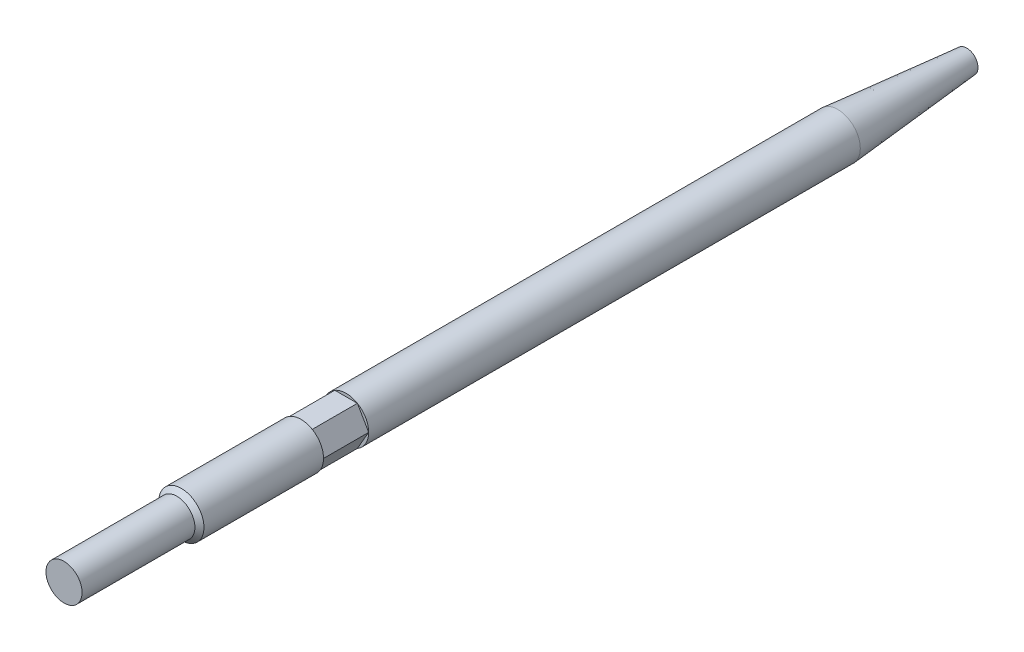
ISO-10303-21;
HEADER;
FILE_DESCRIPTION(('STEP AP214'),'2;1');
FILE_NAME('part.step','',(''),(''),'','','');
FILE_SCHEMA(('AUTOMOTIVE_DESIGN { 1 0 10303 214 1 1 1 1 }'));
ENDSEC;
DATA;
#1=APPLICATION_CONTEXT('core data for automotive mechanical design processes');
#2=APPLICATION_PROTOCOL_DEFINITION('international standard','automotive_design',2000,#1);
#3=PRODUCT_CONTEXT('',#1,'mechanical');
#4=PRODUCT('Part','Part','',(#3));
#5=PRODUCT_RELATED_PRODUCT_CATEGORY('part','',(#4));
#6=PRODUCT_DEFINITION_FORMATION('','',#4);
#7=PRODUCT_DEFINITION_CONTEXT('part definition',#1,'design');
#8=PRODUCT_DEFINITION('design','',#6,#7);
#9=PRODUCT_DEFINITION_SHAPE('','',#8);
#10=(LENGTH_UNIT() NAMED_UNIT(*) SI_UNIT(.MILLI.,.METRE.));
#11=(NAMED_UNIT(*) PLANE_ANGLE_UNIT() SI_UNIT($,.RADIAN.));
#12=(NAMED_UNIT(*) SI_UNIT($,.STERADIAN.) SOLID_ANGLE_UNIT());
#13=UNCERTAINTY_MEASURE_WITH_UNIT(LENGTH_MEASURE(1.E-05),#10,'distance_accuracy_value','');
#14=(GEOMETRIC_REPRESENTATION_CONTEXT(3) GLOBAL_UNCERTAINTY_ASSIGNED_CONTEXT((#13)) GLOBAL_UNIT_ASSIGNED_CONTEXT((#10,
#11,#12)) REPRESENTATION_CONTEXT('',''));
#15=CARTESIAN_POINT('',(0.,0.,0.));
#16=DIRECTION('',(0.,0.,1.));
#17=DIRECTION('',(1.,0.,0.));
#18=AXIS2_PLACEMENT_3D('',#15,#16,#17);
#19=CARTESIAN_POINT('',(0.,0.,500.));
#20=DIRECTION('',(0.,0.,-1.));
#21=DIRECTION('',(-1.,0.,0.));
#22=AXIS2_PLACEMENT_3D('',#19,#20,#21);
#23=CYLINDRICAL_SURFACE('',#22,10.);
#24=CARTESIAN_POINT('',(0.,0.,448.));
#25=DIRECTION('',(0.,0.,1.));
#26=DIRECTION('',(1.,0.,0.));
#27=AXIS2_PLACEMENT_3D('',#24,#25,#26);
#28=CIRCLE('',#27,10.);
#29=CARTESIAN_POINT('',(10.,0.,448.));
#30=VERTEX_POINT('',#29);
#31=EDGE_CURVE('E145',#30,#30,#28,.F.);
#32=ORIENTED_EDGE('',*,*,#31,.T.);
#33=EDGE_LOOP('',(#32));
#34=FACE_BOUND('',#33,.T.);
#35=CARTESIAN_POINT('',(0.,0.,395.));
#36=DIRECTION('',(0.,0.,1.));
#37=DIRECTION('',(1.,0.,0.));
#38=AXIS2_PLACEMENT_3D('',#35,#36,#37);
#39=CIRCLE('',#38,10.);
#40=CARTESIAN_POINT('',(10.,0.,395.));
#41=VERTEX_POINT('',#40);
#42=CARTESIAN_POINT('',(5.,8.66025403784438,395.));
#43=VERTEX_POINT('',#42);
#44=EDGE_CURVE('E136',#41,#43,#39,.T.);
#45=ORIENTED_EDGE('',*,*,#44,.T.);
#46=CARTESIAN_POINT('',(-5.,8.66025403784439,395.));
#47=VERTEX_POINT('',#46);
#48=EDGE_CURVE('E101',#43,#47,#39,.T.);
#49=ORIENTED_EDGE('',*,*,#48,.T.);
#50=CARTESIAN_POINT('',(-9.99999999999999,0.,395.));
#51=VERTEX_POINT('',#50);
#52=EDGE_CURVE('E137',#47,#51,#39,.T.);
#53=ORIENTED_EDGE('',*,*,#52,.T.);
#54=CARTESIAN_POINT('',(-4.99999999999999,-8.66025403784439,395.));
#55=VERTEX_POINT('',#54);
#56=EDGE_CURVE('E138',#51,#55,#39,.T.);
#57=ORIENTED_EDGE('',*,*,#56,.T.);
#58=CARTESIAN_POINT('',(5.,-8.66025403784439,395.));
#59=VERTEX_POINT('',#58);
#60=EDGE_CURVE('E143',#55,#59,#39,.T.);
#61=ORIENTED_EDGE('',*,*,#60,.T.);
#62=EDGE_CURVE('E150',#59,#41,#39,.T.);
#63=ORIENTED_EDGE('',*,*,#62,.T.);
#64=EDGE_LOOP('',(#45,#49,#53,#57,#61,#63));
#65=FACE_BOUND('',#64,.T.);
#66=ADVANCED_FACE('F34',(#34,#65),#23,.T.);
#67=CARTESIAN_POINT('',(0.,0.,450.));
#68=DIRECTION('',(0.,0.,1.));
#69=DIRECTION('',(1.,0.,0.));
#70=AXIS2_PLACEMENT_3D('',#67,#68,#69);
#71=CYLINDRICAL_SURFACE('',#70,8.);
#72=CARTESIAN_POINT('',(0.,0.,450.));
#73=DIRECTION('',(0.,0.,1.));
#74=DIRECTION('',(1.,0.,0.));
#75=AXIS2_PLACEMENT_3D('',#72,#73,#74);
#76=CIRCLE('',#75,8.);
#77=CARTESIAN_POINT('',(8.,0.,450.));
#78=VERTEX_POINT('',#77);
#79=EDGE_CURVE('E161',#78,#78,#76,.T.);
#80=ORIENTED_EDGE('',*,*,#79,.T.);
#81=EDGE_LOOP('',(#80));
#82=FACE_BOUND('',#81,.T.);
#83=CARTESIAN_POINT('',(0.,0.,500.));
#84=DIRECTION('',(0.,0.,1.));
#85=DIRECTION('',(1.,0.,0.));
#86=AXIS2_PLACEMENT_3D('',#83,#84,#85);
#87=CIRCLE('',#86,8.);
#88=CARTESIAN_POINT('',(8.,0.,500.));
#89=VERTEX_POINT('',#88);
#90=EDGE_CURVE('E162',#89,#89,#87,.T.);
#91=ORIENTED_EDGE('',*,*,#90,.F.);
#92=EDGE_LOOP('',(#91));
#93=FACE_BOUND('',#92,.T.);
#94=ADVANCED_FACE('F211',(#82,#93),#71,.T.);
#95=CARTESIAN_POINT('',(0.,0.,500.));
#96=DIRECTION('',(0.,0.,1.));
#97=DIRECTION('',(1.,0.,0.));
#98=AXIS2_PLACEMENT_3D('',#95,#96,#97);
#99=PLANE('',#98);
#100=ORIENTED_EDGE('',*,*,#90,.T.);
#101=EDGE_LOOP('',(#100));
#102=FACE_BOUND('',#101,.T.);
#103=ADVANCED_FACE('F217',(#102),#99,.T.);
#104=CARTESIAN_POINT('',(0.,0.,450.));
#105=DIRECTION('',(0.,0.,-1.));
#106=DIRECTION('',(-1.,0.,0.));
#107=AXIS2_PLACEMENT_3D('',#104,#105,#106);
#108=CONICAL_SURFACE('',#107,8.00000000000012,0.785398163397474);
#109=ORIENTED_EDGE('',*,*,#31,.F.);
#110=EDGE_LOOP('',(#109));
#111=FACE_BOUND('',#110,.T.);
#112=ORIENTED_EDGE('',*,*,#79,.F.);
#113=EDGE_LOOP('',(#112));
#114=FACE_BOUND('',#113,.T.);
#115=ADVANCED_FACE('F240',(#111,#114),#108,.T.);
#116=CARTESIAN_POINT('',(0.,0.,375.));
#117=DIRECTION('',(0.,0.,1.));
#118=DIRECTION('',(1.,0.,0.));
#119=AXIS2_PLACEMENT_3D('',#116,#117,#118);
#120=PLANE('',#119);
#121=CARTESIAN_POINT('',(0.,0.,375.));
#122=DIRECTION('',(0.,0.,1.));
#123=DIRECTION('',(1.,0.,0.));
#124=AXIS2_PLACEMENT_3D('',#121,#122,#123);
#125=CIRCLE('',#124,10.);
#126=CARTESIAN_POINT('',(10.,0.,375.));
#127=VERTEX_POINT('',#126);
#128=CARTESIAN_POINT('',(5.,8.66025403784438,375.));
#129=VERTEX_POINT('',#128);
#130=EDGE_CURVE('E92',#127,#129,#125,.T.);
#131=ORIENTED_EDGE('',*,*,#130,.T.);
#132=DIRECTION('',(-0.5,0.866025403784439,0.));
#133=VECTOR('',#132,1.);
#134=CARTESIAN_POINT('',(10.,0.,375.));
#135=LINE('',#134,#133);
#136=EDGE_CURVE('E96',#127,#129,#135,.T.);
#137=ORIENTED_EDGE('',*,*,#136,.F.);
#138=EDGE_LOOP('',(#131,#137));
#139=FACE_BOUND('',#138,.T.);
#140=ADVANCED_FACE('F94',(#139),#120,.T.);
#141=CARTESIAN_POINT('',(-5.,8.66025403784439,375.));
#142=VERTEX_POINT('',#141);
#143=EDGE_CURVE('E104',#129,#142,#125,.T.);
#144=ORIENTED_EDGE('',*,*,#143,.T.);
#145=DIRECTION('',(-1.,0.,0.));
#146=VECTOR('',#145,1.);
#147=CARTESIAN_POINT('',(5.,8.66025403784438,375.));
#148=LINE('',#147,#146);
#149=EDGE_CURVE('E112',#129,#142,#148,.T.);
#150=ORIENTED_EDGE('',*,*,#149,.F.);
#151=EDGE_LOOP('',(#144,#150));
#152=FACE_BOUND('',#151,.T.);
#153=ADVANCED_FACE('F121',(#152),#120,.T.);
#154=CARTESIAN_POINT('',(-9.99999999999999,0.,375.));
#155=VERTEX_POINT('',#154);
#156=EDGE_CURVE('E132',#142,#155,#125,.T.);
#157=ORIENTED_EDGE('',*,*,#156,.T.);
#158=DIRECTION('',(-0.5,-0.866025403784439,0.));
#159=VECTOR('',#158,1.);
#160=CARTESIAN_POINT('',(-5.,8.66025403784439,375.));
#161=LINE('',#160,#159);
#162=EDGE_CURVE('E123',#142,#155,#161,.T.);
#163=ORIENTED_EDGE('',*,*,#162,.F.);
#164=EDGE_LOOP('',(#157,#163));
#165=FACE_BOUND('',#164,.T.);
#166=ADVANCED_FACE('F199',(#165),#120,.T.);
#167=CARTESIAN_POINT('',(-4.99999999999999,-8.66025403784439,375.));
#168=VERTEX_POINT('',#167);
#169=EDGE_CURVE('E139',#155,#168,#125,.T.);
#170=ORIENTED_EDGE('',*,*,#169,.T.);
#171=DIRECTION('',(0.5,-0.866025403784439,0.));
#172=VECTOR('',#171,1.);
#173=CARTESIAN_POINT('',(-9.99999999999999,0.,375.));
#174=LINE('',#173,#172);
#175=EDGE_CURVE('E191',#155,#168,#174,.T.);
#176=ORIENTED_EDGE('',*,*,#175,.F.);
#177=EDGE_LOOP('',(#170,#176));
#178=FACE_BOUND('',#177,.T.);
#179=ADVANCED_FACE('F201',(#178),#120,.T.);
#180=CARTESIAN_POINT('',(5.,-8.66025403784439,375.));
#181=VERTEX_POINT('',#180);
#182=EDGE_CURVE('E146',#168,#181,#125,.T.);
#183=ORIENTED_EDGE('',*,*,#182,.T.);
#184=DIRECTION('',(1.,0.,0.));
#185=VECTOR('',#184,1.);
#186=CARTESIAN_POINT('',(-4.99999999999999,-8.66025403784439,375.));
#187=LINE('',#186,#185);
#188=EDGE_CURVE('E58',#168,#181,#187,.T.);
#189=ORIENTED_EDGE('',*,*,#188,.F.);
#190=EDGE_LOOP('',(#183,#189));
#191=FACE_BOUND('',#190,.T.);
#192=ADVANCED_FACE('F207',(#191),#120,.T.);
#193=EDGE_CURVE('E102',#181,#127,#125,.T.);
#194=ORIENTED_EDGE('',*,*,#193,.T.);
#195=DIRECTION('',(0.5,0.866025403784439,0.));
#196=VECTOR('',#195,1.);
#197=CARTESIAN_POINT('',(5.,-8.66025403784439,375.));
#198=LINE('',#197,#196);
#199=EDGE_CURVE('E118',#181,#127,#198,.T.);
#200=ORIENTED_EDGE('',*,*,#199,.F.);
#201=EDGE_LOOP('',(#194,#200));
#202=FACE_BOUND('',#201,.T.);
#203=ADVANCED_FACE('F251',(#202),#120,.T.);
#204=CARTESIAN_POINT('',(0.,0.,395.));
#205=DIRECTION('',(0.,0.,1.));
#206=DIRECTION('',(1.,0.,0.));
#207=AXIS2_PLACEMENT_3D('',#204,#205,#206);
#208=PLANE('',#207);
#209=DIRECTION('',(-0.5,0.866025403784439,0.));
#210=VECTOR('',#209,1.);
#211=CARTESIAN_POINT('',(10.,0.,395.));
#212=LINE('',#211,#210);
#213=EDGE_CURVE('E50',#41,#43,#212,.T.);
#214=ORIENTED_EDGE('',*,*,#213,.T.);
#215=ORIENTED_EDGE('',*,*,#44,.F.);
#216=EDGE_LOOP('',(#214,#215));
#217=FACE_BOUND('',#216,.T.);
#218=ADVANCED_FACE('F238',(#217),#208,.F.);
#219=DIRECTION('',(-1.,0.,0.));
#220=VECTOR('',#219,1.);
#221=CARTESIAN_POINT('',(5.,8.66025403784438,395.));
#222=LINE('',#221,#220);
#223=EDGE_CURVE('E115',#43,#47,#222,.T.);
#224=ORIENTED_EDGE('',*,*,#223,.T.);
#225=ORIENTED_EDGE('',*,*,#48,.F.);
#226=EDGE_LOOP('',(#224,#225));
#227=FACE_BOUND('',#226,.T.);
#228=ADVANCED_FACE('F267',(#227),#208,.F.);
#229=DIRECTION('',(-0.5,-0.866025403784439,0.));
#230=VECTOR('',#229,1.);
#231=CARTESIAN_POINT('',(-5.,8.66025403784439,395.));
#232=LINE('',#231,#230);
#233=EDGE_CURVE('E184',#47,#51,#232,.T.);
#234=ORIENTED_EDGE('',*,*,#233,.T.);
#235=ORIENTED_EDGE('',*,*,#52,.F.);
#236=EDGE_LOOP('',(#234,#235));
#237=FACE_BOUND('',#236,.T.);
#238=ADVANCED_FACE('F392',(#237),#208,.F.);
#239=DIRECTION('',(0.5,-0.866025403784439,0.));
#240=VECTOR('',#239,1.);
#241=CARTESIAN_POINT('',(-9.99999999999999,0.,395.));
#242=LINE('',#241,#240);
#243=EDGE_CURVE('E181',#51,#55,#242,.T.);
#244=ORIENTED_EDGE('',*,*,#243,.T.);
#245=ORIENTED_EDGE('',*,*,#56,.F.);
#246=EDGE_LOOP('',(#244,#245));
#247=FACE_BOUND('',#246,.T.);
#248=ADVANCED_FACE('F384',(#247),#208,.F.);
#249=DIRECTION('',(1.,0.,0.));
#250=VECTOR('',#249,1.);
#251=CARTESIAN_POINT('',(-4.99999999999999,-8.66025403784439,395.));
#252=LINE('',#251,#250);
#253=EDGE_CURVE('E178',#55,#59,#252,.T.);
#254=ORIENTED_EDGE('',*,*,#253,.T.);
#255=ORIENTED_EDGE('',*,*,#60,.F.);
#256=EDGE_LOOP('',(#254,#255));
#257=FACE_BOUND('',#256,.T.);
#258=ADVANCED_FACE('F376',(#257),#208,.F.);
#259=DIRECTION('',(0.5,0.866025403784439,0.));
#260=VECTOR('',#259,1.);
#261=CARTESIAN_POINT('',(5.,-8.66025403784439,395.));
#262=LINE('',#261,#260);
#263=EDGE_CURVE('E128',#59,#41,#262,.T.);
#264=ORIENTED_EDGE('',*,*,#263,.T.);
#265=ORIENTED_EDGE('',*,*,#62,.F.);
#266=EDGE_LOOP('',(#264,#265));
#267=FACE_BOUND('',#266,.T.);
#268=ADVANCED_FACE('F269',(#267),#208,.F.);
#269=CARTESIAN_POINT('',(10.,0.,375.));
#270=DIRECTION('',(0.866025403784439,0.5,0.));
#271=DIRECTION('',(-0.5,0.866025403784439,0.));
#272=AXIS2_PLACEMENT_3D('',#269,#270,#271);
#273=PLANE('',#272);
#274=ORIENTED_EDGE('',*,*,#213,.F.);
#275=DIRECTION('',(0.,0.,1.));
#276=VECTOR('',#275,1.);
#277=CARTESIAN_POINT('',(10.,0.,375.));
#278=LINE('',#277,#276);
#279=EDGE_CURVE('E127',#127,#41,#278,.T.);
#280=ORIENTED_EDGE('',*,*,#279,.F.);
#281=ORIENTED_EDGE('',*,*,#136,.T.);
#282=DIRECTION('',(0.,0.,1.));
#283=VECTOR('',#282,1.);
#284=CARTESIAN_POINT('',(5.,8.66025403784438,375.));
#285=LINE('',#284,#283);
#286=EDGE_CURVE('E108',#129,#43,#285,.T.);
#287=ORIENTED_EDGE('',*,*,#286,.T.);
#288=EDGE_LOOP('',(#274,#280,#281,#287));
#289=FACE_BOUND('',#288,.T.);
#290=ADVANCED_FACE('F125',(#289),#273,.T.);
#291=CARTESIAN_POINT('',(5.,-8.66025403784439,375.));
#292=DIRECTION('',(0.866025403784439,-0.5,0.));
#293=DIRECTION('',(0.5,0.866025403784439,0.));
#294=AXIS2_PLACEMENT_3D('',#291,#292,#293);
#295=PLANE('',#294);
#296=ORIENTED_EDGE('',*,*,#263,.F.);
#297=DIRECTION('',(0.,0.,1.));
#298=VECTOR('',#297,1.);
#299=CARTESIAN_POINT('',(5.,-8.66025403784439,375.));
#300=LINE('',#299,#298);
#301=EDGE_CURVE('E174',#181,#59,#300,.T.);
#302=ORIENTED_EDGE('',*,*,#301,.F.);
#303=ORIENTED_EDGE('',*,*,#199,.T.);
#304=ORIENTED_EDGE('',*,*,#279,.T.);
#305=EDGE_LOOP('',(#296,#302,#303,#304));
#306=FACE_BOUND('',#305,.T.);
#307=ADVANCED_FACE('F354',(#306),#295,.T.);
#308=CARTESIAN_POINT('',(-4.99999999999999,-8.66025403784439,375.));
#309=DIRECTION('',(0.,-1.,0.));
#310=DIRECTION('',(0.,0.,-1.));
#311=AXIS2_PLACEMENT_3D('',#308,#309,#310);
#312=PLANE('',#311);
#313=ORIENTED_EDGE('',*,*,#253,.F.);
#314=DIRECTION('',(0.,0.,1.));
#315=VECTOR('',#314,1.);
#316=CARTESIAN_POINT('',(-4.99999999999999,-8.66025403784439,375.));
#317=LINE('',#316,#315);
#318=EDGE_CURVE('E171',#168,#55,#317,.T.);
#319=ORIENTED_EDGE('',*,*,#318,.F.);
#320=ORIENTED_EDGE('',*,*,#188,.T.);
#321=ORIENTED_EDGE('',*,*,#301,.T.);
#322=EDGE_LOOP('',(#313,#319,#320,#321));
#323=FACE_BOUND('',#322,.T.);
#324=ADVANCED_FACE('F345',(#323),#312,.T.);
#325=CARTESIAN_POINT('',(-9.99999999999999,0.,375.));
#326=DIRECTION('',(-0.866025403784438,-0.5,0.));
#327=DIRECTION('',(0.5,-0.866025403784439,0.));
#328=AXIS2_PLACEMENT_3D('',#325,#326,#327);
#329=PLANE('',#328);
#330=ORIENTED_EDGE('',*,*,#243,.F.);
#331=DIRECTION('',(0.,0.,1.));
#332=VECTOR('',#331,1.);
#333=CARTESIAN_POINT('',(-9.99999999999999,0.,375.));
#334=LINE('',#333,#332);
#335=EDGE_CURVE('E168',#155,#51,#334,.T.);
#336=ORIENTED_EDGE('',*,*,#335,.F.);
#337=ORIENTED_EDGE('',*,*,#175,.T.);
#338=ORIENTED_EDGE('',*,*,#318,.T.);
#339=EDGE_LOOP('',(#330,#336,#337,#338));
#340=FACE_BOUND('',#339,.T.);
#341=ADVANCED_FACE('F337',(#340),#329,.T.);
#342=CARTESIAN_POINT('',(-5.,8.66025403784439,375.));
#343=DIRECTION('',(-0.866025403784439,0.5,0.));
#344=DIRECTION('',(-0.5,-0.866025403784439,0.));
#345=AXIS2_PLACEMENT_3D('',#342,#343,#344);
#346=PLANE('',#345);
#347=ORIENTED_EDGE('',*,*,#233,.F.);
#348=DIRECTION('',(0.,0.,1.));
#349=VECTOR('',#348,1.);
#350=CARTESIAN_POINT('',(-5.,8.66025403784439,375.));
#351=LINE('',#350,#349);
#352=EDGE_CURVE('E117',#142,#47,#351,.T.);
#353=ORIENTED_EDGE('',*,*,#352,.F.);
#354=ORIENTED_EDGE('',*,*,#162,.T.);
#355=ORIENTED_EDGE('',*,*,#335,.T.);
#356=EDGE_LOOP('',(#347,#353,#354,#355));
#357=FACE_BOUND('',#356,.T.);
#358=ADVANCED_FACE('F198',(#357),#346,.T.);
#359=CARTESIAN_POINT('',(5.,8.66025403784438,375.));
#360=DIRECTION('',(0.,1.,0.));
#361=DIRECTION('',(-1.,0.,0.));
#362=AXIS2_PLACEMENT_3D('',#359,#360,#361);
#363=PLANE('',#362);
#364=ORIENTED_EDGE('',*,*,#223,.F.);
#365=ORIENTED_EDGE('',*,*,#286,.F.);
#366=ORIENTED_EDGE('',*,*,#149,.T.);
#367=ORIENTED_EDGE('',*,*,#352,.T.);
#368=EDGE_LOOP('',(#364,#365,#366,#367));
#369=FACE_BOUND('',#368,.T.);
#370=ADVANCED_FACE('F110',(#369),#363,.T.);
#371=CARTESIAN_POINT('',(0.,0.,100.));
#372=DIRECTION('',(0.,0.,-1.));
#373=DIRECTION('',(-1.,0.,0.));
#374=AXIS2_PLACEMENT_3D('',#371,#372,#373);
#375=PLANE('',#374);
#376=CARTESIAN_POINT('',(0.,0.,100.));
#377=DIRECTION('',(0.,0.,-1.));
#378=DIRECTION('',(-1.,0.,0.));
#379=AXIS2_PLACEMENT_3D('',#376,#377,#378);
#380=CIRCLE('',#379,5.00000000000062);
#381=CARTESIAN_POINT('',(5.00000000000062,0.,100.));
#382=VERTEX_POINT('',#381);
#383=EDGE_CURVE('E43',#382,#382,#380,.T.);
#384=ORIENTED_EDGE('',*,*,#383,.T.);
#385=EDGE_LOOP('',(#384));
#386=FACE_BOUND('',#385,.T.);
#387=ADVANCED_FACE('F222',(#386),#375,.T.);
#388=CARTESIAN_POINT('',(0.,0.,157.1502615138));
#389=DIRECTION('',(0.,0.,-1.));
#390=DIRECTION('',(-1.,0.,0.));
#391=AXIS2_PLACEMENT_3D('',#388,#389,#390);
#392=CIRCLE('',#391,10.);
#393=CARTESIAN_POINT('',(10.,0.,157.1502615138));
#394=VERTEX_POINT('',#393);
#395=EDGE_CURVE('E11',#394,#394,#392,.F.);
#396=ORIENTED_EDGE('',*,*,#395,.T.);
#397=EDGE_LOOP('',(#396));
#398=FACE_BOUND('',#397,.T.);
#399=ORIENTED_EDGE('',*,*,#143,.F.);
#400=ORIENTED_EDGE('',*,*,#130,.F.);
#401=ORIENTED_EDGE('',*,*,#193,.F.);
#402=ORIENTED_EDGE('',*,*,#182,.F.);
#403=ORIENTED_EDGE('',*,*,#169,.F.);
#404=ORIENTED_EDGE('',*,*,#156,.F.);
#405=EDGE_LOOP('',(#399,#400,#401,#402,#403,#404));
#406=FACE_BOUND('',#405,.T.);
#407=ADVANCED_FACE('F130',(#398,#406),#23,.T.);
#408=CARTESIAN_POINT('',(0.,0.,100.));
#409=DIRECTION('',(0.,0.,1.));
#410=DIRECTION('',(1.,0.,0.));
#411=AXIS2_PLACEMENT_3D('',#408,#409,#410);
#412=CONICAL_SURFACE('',#411,5.00000000000062,0.0872664625997166);
#413=CARTESIAN_POINT('',(10.,0.,157.1502615138));
#414=CARTESIAN_POINT('',(9.94791666666668,0.,156.554946289698));
#415=CARTESIAN_POINT('',(9.89583333333335,0.,155.959631065595));
#416=CARTESIAN_POINT('',(9.79166666666669,0.,154.769000617391));
#417=CARTESIAN_POINT('',(9.73958333333337,0.,154.173685393289));
#418=CARTESIAN_POINT('',(9.63541666666671,0.,152.983054945085));
#419=CARTESIAN_POINT('',(9.58333333333339,0.,152.387739720983));
#420=CARTESIAN_POINT('',(9.47916666666674,0.,151.197109272779));
#421=CARTESIAN_POINT('',(9.42708333333341,0.,150.601794048677));
#422=CARTESIAN_POINT('',(9.32291666666675,0.,149.411163600473));
#423=CARTESIAN_POINT('',(9.27083333333342,0.,148.81584837637));
#424=CARTESIAN_POINT('',(9.16666666666677,0.,147.625217928166));
#425=CARTESIAN_POINT('',(9.11458333333345,0.,147.029902704064));
#426=CARTESIAN_POINT('',(9.01041666666679,0.,145.83927225586));
#427=CARTESIAN_POINT('',(8.95833333333347,0.,145.243957031758));
#428=CARTESIAN_POINT('',(8.85416666666681,0.,144.053326583554));
#429=CARTESIAN_POINT('',(8.80208333333348,0.,143.458011359452));
#430=CARTESIAN_POINT('',(8.69791666666683,0.,142.267380911248));
#431=CARTESIAN_POINT('',(8.6458333333335,0.,141.672065687146));
#432=CARTESIAN_POINT('',(8.54166666666685,0.,140.481435238941));
#433=CARTESIAN_POINT('',(8.48958333333352,0.,139.886120014839));
#434=CARTESIAN_POINT('',(8.38541666666687,0.,138.695489566635));
#435=CARTESIAN_POINT('',(8.33333333333354,0.,138.100174342533));
#436=CARTESIAN_POINT('',(8.22916666666689,0.,136.909543894329));
#437=CARTESIAN_POINT('',(8.17708333333356,0.,136.314228670227));
#438=CARTESIAN_POINT('',(8.07291666666691,0.,135.123598222023));
#439=CARTESIAN_POINT('',(8.02083333333358,0.,134.528282997921));
#440=CARTESIAN_POINT('',(7.91666666666693,0.,133.337652549716));
#441=CARTESIAN_POINT('',(7.8645833333336,0.,132.742337325614));
#442=CARTESIAN_POINT('',(7.76041666666695,0.,131.55170687741));
#443=CARTESIAN_POINT('',(7.70833333333362,0.,130.956391653308));
#444=CARTESIAN_POINT('',(7.60416666666696,0.,129.765761205104));
#445=CARTESIAN_POINT('',(7.55208333333364,0.,129.170445981002));
#446=CARTESIAN_POINT('',(7.44791666666698,0.,127.979815532798));
#447=CARTESIAN_POINT('',(7.39583333333366,0.,127.384500308696));
#448=CARTESIAN_POINT('',(7.291666666667,0.,126.193869860491));
#449=CARTESIAN_POINT('',(7.23958333333368,0.,125.598554636389));
#450=CARTESIAN_POINT('',(7.13541666666702,0.,124.407924188185));
#451=CARTESIAN_POINT('',(7.0833333333337,0.,123.812608964083));
#452=CARTESIAN_POINT('',(6.97916666666704,0.,122.621978515879));
#453=CARTESIAN_POINT('',(6.92708333333371,0.,122.026663291777));
#454=CARTESIAN_POINT('',(6.82291666666706,0.,120.836032843573));
#455=CARTESIAN_POINT('',(6.77083333333373,0.,120.240717619471));
#456=CARTESIAN_POINT('',(6.66666666666708,0.,119.050087171267));
#457=CARTESIAN_POINT('',(6.61458333333375,0.,118.454771947164));
#458=CARTESIAN_POINT('',(6.5104166666671,0.,117.26414149896));
#459=CARTESIAN_POINT('',(6.45833333333377,0.,116.668826274858));
#460=CARTESIAN_POINT('',(6.35416666666712,0.,115.478195826654));
#461=CARTESIAN_POINT('',(6.30208333333379,0.,114.882880602552));
#462=CARTESIAN_POINT('',(6.19791666666714,0.,113.692250154348));
#463=CARTESIAN_POINT('',(6.14583333333381,0.,113.096934930246));
#464=CARTESIAN_POINT('',(6.04166666666716,0.,111.906304482042));
#465=CARTESIAN_POINT('',(5.98958333333383,0.,111.310989257939));
#466=CARTESIAN_POINT('',(5.88541666666718,0.,110.120358809735));
#467=CARTESIAN_POINT('',(5.83333333333385,0.,109.525043585633));
#468=CARTESIAN_POINT('',(5.7291666666672,0.,108.334413137429));
#469=CARTESIAN_POINT('',(5.67708333333387,0.,107.739097913327));
#470=CARTESIAN_POINT('',(5.57291666666721,0.,106.548467465123));
#471=CARTESIAN_POINT('',(5.52083333333389,0.,105.953152241021));
#472=CARTESIAN_POINT('',(5.41666666666724,0.,104.762521792817));
#473=CARTESIAN_POINT('',(5.36458333333391,0.,104.167206568715));
#474=CARTESIAN_POINT('',(5.26041666666725,0.,102.97657612051));
#475=CARTESIAN_POINT('',(5.20833333333393,0.,102.381260896408));
#476=CARTESIAN_POINT('',(5.10416666666727,0.,101.190630448204));
#477=CARTESIAN_POINT('',(5.05208333333395,0.,100.595315224102));
#478=CARTESIAN_POINT('',(5.00000000000062,0.,100.));
#479=B_SPLINE_CURVE_WITH_KNOTS('',3,(#413,#414,#415,#416,#417,#418,#419,#420,#421,#422,#423,
#424,#425,#426,#427,#428,#429,#430,#431,#432,#433,#434,#435,#436,#437,#438,#439,#440,#441,#442,
#443,#444,#445,#446,#447,#448,#449,#450,#451,#452,#453,#454,#455,#456,#457,#458,#459,#460,#461,
#462,#463,#464,#465,#466,#467,#468,#469,#470,#471,#472,#473,#474,#475,#476,#477,#478),
.UNSPECIFIED.,.F.,.F.,(4,2,2,2,2,2,2,2,2,2,2,2,2,2,2,2,2,2,2,2,2,2,2,2,2,2,2,2,2,2,2,2,4),(0.,
1.7927676946357,3.58553538927138,5.37830308390708,7.17107077854279,8.96383847317846,
10.7566061678142,12.5493738624498,14.3421415570855,16.1349092517212,17.9276769463569,
19.7204446409926,21.5132123356283,23.305980030264,25.0987477248997,26.8915154195354,
28.6842831141711,30.4770508088068,32.2698185034425,34.0625861980782,35.8553538927139,
37.6481215873495,39.4408892819852,41.2336569766209,43.0264246712566,44.8191923658923,
46.611960060528,48.4047277551637,50.1974954497994,51.9902631444351,53.7830308390708,
55.5757985337065,57.3685662283422),.UNSPECIFIED.);
#480=EDGE_CURVE('BSEAM37',#394,#382,#479,.T.);
#481=ORIENTED_EDGE('',*,*,#395,.F.);
#482=ORIENTED_EDGE('',*,*,#383,.F.);
#483=ORIENTED_EDGE('',*,*,#480,.T.);
#484=ORIENTED_EDGE('',*,*,#480,.F.);
#485=EDGE_LOOP('',(#481,#483,#482,#484));
#486=FACE_BOUND('',#485,.T.);
#487=ADVANCED_FACE('F37',(#486),#412,.T.);
#488=CLOSED_SHELL('',(#66,#94,#103,#115,#140,#153,#166,#179,#192,#203,#218,#228,#238,#248,#258,
#268,#290,#307,#324,#341,#358,#370,#387,#407,#487));
#489=MANIFOLD_SOLID_BREP('B2',#488);
#490=ADVANCED_BREP_SHAPE_REPRESENTATION('',(#18,#489),#14);
#491=SHAPE_DEFINITION_REPRESENTATION(#9,#490);
ENDSEC;
END-ISO-10303-21;
